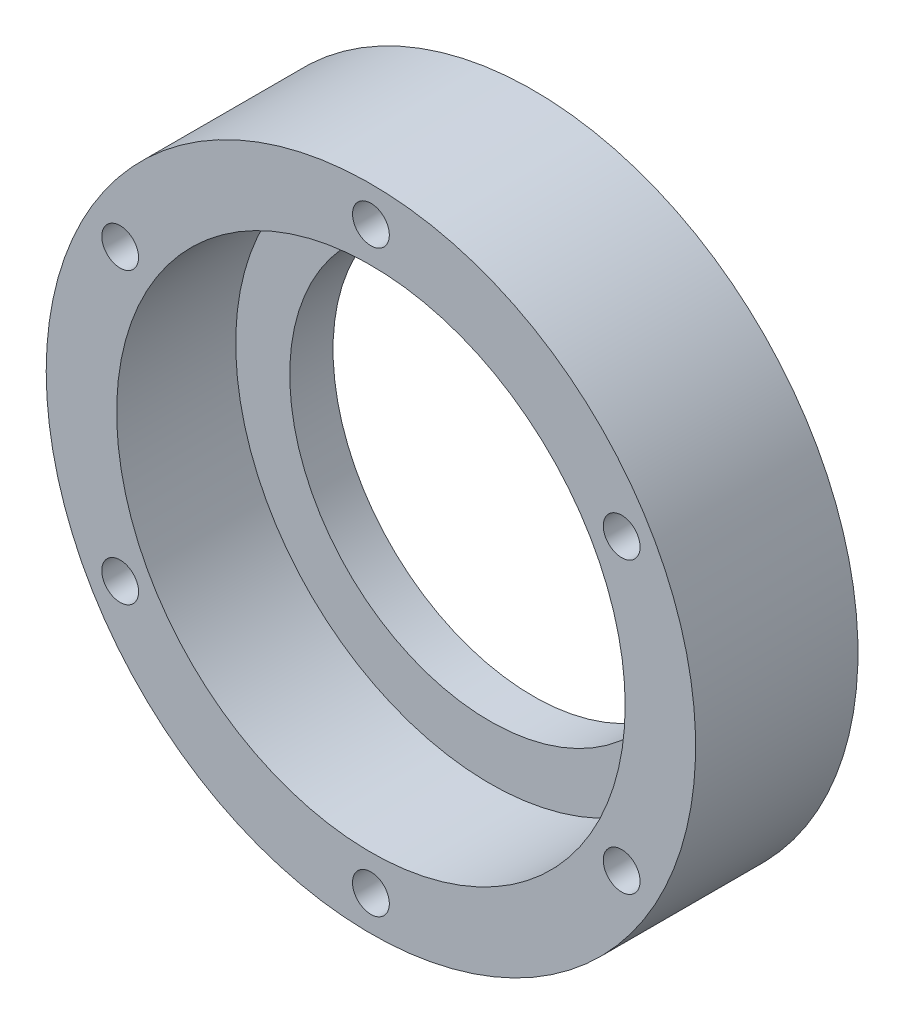
ISO-10303-21;
HEADER;
FILE_DESCRIPTION(('STEP AP214'),'2;1');
FILE_NAME('part.step','',(''),(''),'','','');
FILE_SCHEMA(('AUTOMOTIVE_DESIGN { 1 0 10303 214 1 1 1 1 }'));
ENDSEC;
DATA;
#1=APPLICATION_CONTEXT('core data for automotive mechanical design processes');
#2=APPLICATION_PROTOCOL_DEFINITION('international standard','automotive_design',2000,#1);
#3=PRODUCT_CONTEXT('',#1,'mechanical');
#4=PRODUCT('Part','Part','',(#3));
#5=PRODUCT_RELATED_PRODUCT_CATEGORY('part','',(#4));
#6=PRODUCT_DEFINITION_FORMATION('','',#4);
#7=PRODUCT_DEFINITION_CONTEXT('part definition',#1,'design');
#8=PRODUCT_DEFINITION('design','',#6,#7);
#9=PRODUCT_DEFINITION_SHAPE('','',#8);
#10=(LENGTH_UNIT() NAMED_UNIT(*) SI_UNIT(.MILLI.,.METRE.));
#11=(NAMED_UNIT(*) PLANE_ANGLE_UNIT() SI_UNIT($,.RADIAN.));
#12=(NAMED_UNIT(*) SI_UNIT($,.STERADIAN.) SOLID_ANGLE_UNIT());
#13=UNCERTAINTY_MEASURE_WITH_UNIT(LENGTH_MEASURE(1.E-05),#10,'distance_accuracy_value','');
#14=(GEOMETRIC_REPRESENTATION_CONTEXT(3) GLOBAL_UNCERTAINTY_ASSIGNED_CONTEXT((#13)) GLOBAL_UNIT_ASSIGNED_CONTEXT((#10,
#11,#12)) REPRESENTATION_CONTEXT('',''));
#15=CARTESIAN_POINT('',(0.,0.,0.));
#16=DIRECTION('',(0.,0.,1.));
#17=DIRECTION('',(1.,0.,0.));
#18=AXIS2_PLACEMENT_3D('',#15,#16,#17);
#19=CARTESIAN_POINT('',(0.,0.,15.));
#20=DIRECTION('',(0.,0.,-1.));
#21=DIRECTION('',(-1.,0.,0.));
#22=AXIS2_PLACEMENT_3D('',#19,#20,#21);
#23=CYLINDRICAL_SURFACE('',#22,30.);
#24=CARTESIAN_POINT('',(0.,0.,15.));
#25=DIRECTION('',(0.,0.,-1.));
#26=DIRECTION('',(-1.,0.,0.));
#27=AXIS2_PLACEMENT_3D('',#24,#25,#26);
#28=CIRCLE('',#27,30.);
#29=CARTESIAN_POINT('',(-30.,0.,15.));
#30=VERTEX_POINT('',#29);
#31=EDGE_CURVE('E78',#30,#30,#28,.T.);
#32=ORIENTED_EDGE('',*,*,#31,.T.);
#33=EDGE_LOOP('',(#32));
#34=FACE_BOUND('',#33,.T.);
#35=CARTESIAN_POINT('',(0.,0.,0.));
#36=DIRECTION('',(0.,0.,-1.));
#37=DIRECTION('',(-1.,0.,0.));
#38=AXIS2_PLACEMENT_3D('',#35,#36,#37);
#39=CIRCLE('',#38,30.);
#40=CARTESIAN_POINT('',(-30.,0.,0.));
#41=VERTEX_POINT('',#40);
#42=EDGE_CURVE('E81',#41,#41,#39,.T.);
#43=ORIENTED_EDGE('',*,*,#42,.F.);
#44=EDGE_LOOP('',(#43));
#45=FACE_BOUND('',#44,.T.);
#46=ADVANCED_FACE('F34',(#34,#45),#23,.T.);
#47=CARTESIAN_POINT('',(30.,0.,15.));
#48=DIRECTION('',(0.,0.,1.));
#49=DIRECTION('',(1.,0.,0.));
#50=AXIS2_PLACEMENT_3D('',#47,#48,#49);
#51=PLANE('',#50);
#52=CARTESIAN_POINT('',(0.,0.,15.));
#53=DIRECTION('',(0.,0.,1.));
#54=DIRECTION('',(1.,0.,0.));
#55=AXIS2_PLACEMENT_3D('',#52,#53,#54);
#56=CIRCLE('',#55,23.49119);
#57=CARTESIAN_POINT('',(23.49119,0.,15.));
#58=VERTEX_POINT('',#57);
#59=EDGE_CURVE('E111',#58,#58,#56,.T.);
#60=ORIENTED_EDGE('',*,*,#59,.F.);
#61=EDGE_LOOP('',(#60));
#62=FACE_BOUND('',#61,.T.);
#63=CARTESIAN_POINT('',(23.166179551236,-13.3749999999987,15.));
#64=DIRECTION('',(0.,0.,-1.));
#65=DIRECTION('',(-1.,0.,0.));
#66=AXIS2_PLACEMENT_3D('',#63,#64,#65);
#67=CIRCLE('',#66,1.69999999999999);
#68=CARTESIAN_POINT('',(21.466179551236,-13.3749999999987,15.));
#69=VERTEX_POINT('',#68);
#70=EDGE_CURVE('E99',#69,#69,#67,.T.);
#71=ORIENTED_EDGE('',*,*,#70,.T.);
#72=EDGE_LOOP('',(#71));
#73=FACE_BOUND('',#72,.T.);
#74=CARTESIAN_POINT('',(23.1661795512345,13.3750000000013,15.));
#75=DIRECTION('',(0.,0.,-1.));
#76=DIRECTION('',(-1.,0.,0.));
#77=AXIS2_PLACEMENT_3D('',#74,#75,#76);
#78=CIRCLE('',#77,1.69999999999999);
#79=CARTESIAN_POINT('',(21.4661795512345,13.3750000000013,15.));
#80=VERTEX_POINT('',#79);
#81=EDGE_CURVE('E96',#80,#80,#78,.T.);
#82=ORIENTED_EDGE('',*,*,#81,.T.);
#83=EDGE_LOOP('',(#82));
#84=FACE_BOUND('',#83,.T.);
#85=CARTESIAN_POINT('',(0.,26.75,15.));
#86=DIRECTION('',(0.,0.,-1.));
#87=DIRECTION('',(-1.,0.,0.));
#88=AXIS2_PLACEMENT_3D('',#85,#86,#87);
#89=CIRCLE('',#88,1.69999999999999);
#90=CARTESIAN_POINT('',(-1.69999999999999,26.75,15.));
#91=VERTEX_POINT('',#90);
#92=EDGE_CURVE('E93',#91,#91,#89,.T.);
#93=ORIENTED_EDGE('',*,*,#92,.T.);
#94=EDGE_LOOP('',(#93));
#95=FACE_BOUND('',#94,.T.);
#96=CARTESIAN_POINT('',(-23.1661795512315,-13.3750000000013,15.));
#97=DIRECTION('',(0.,0.,-1.));
#98=DIRECTION('',(-1.,0.,0.));
#99=AXIS2_PLACEMENT_3D('',#96,#97,#98);
#100=CIRCLE('',#99,1.69999999999999);
#101=CARTESIAN_POINT('',(-24.8661795512314,-13.3750000000013,15.));
#102=VERTEX_POINT('',#101);
#103=EDGE_CURVE('E90',#102,#102,#100,.T.);
#104=ORIENTED_EDGE('',*,*,#103,.T.);
#105=EDGE_LOOP('',(#104));
#106=FACE_BOUND('',#105,.T.);
#107=CARTESIAN_POINT('',(3.03457104867779E-12,-26.75,15.));
#108=DIRECTION('',(0.,0.,-1.));
#109=DIRECTION('',(-1.,0.,0.));
#110=AXIS2_PLACEMENT_3D('',#107,#108,#109);
#111=CIRCLE('',#110,1.69999999999999);
#112=CARTESIAN_POINT('',(-1.69999999999695,-26.75,15.));
#113=VERTEX_POINT('',#112);
#114=EDGE_CURVE('E87',#113,#113,#111,.T.);
#115=ORIENTED_EDGE('',*,*,#114,.T.);
#116=EDGE_LOOP('',(#115));
#117=FACE_BOUND('',#116,.T.);
#118=CARTESIAN_POINT('',(-23.166179551233,13.3749999999987,15.));
#119=DIRECTION('',(0.,0.,-1.));
#120=DIRECTION('',(-1.,0.,0.));
#121=AXIS2_PLACEMENT_3D('',#118,#119,#120);
#122=CIRCLE('',#121,1.69999999999999);
#123=CARTESIAN_POINT('',(-24.866179551233,13.3749999999987,15.));
#124=VERTEX_POINT('',#123);
#125=EDGE_CURVE('E84',#124,#124,#122,.T.);
#126=ORIENTED_EDGE('',*,*,#125,.T.);
#127=EDGE_LOOP('',(#126));
#128=FACE_BOUND('',#127,.T.);
#129=ORIENTED_EDGE('',*,*,#31,.F.);
#130=EDGE_LOOP('',(#129));
#131=FACE_BOUND('',#130,.T.);
#132=ADVANCED_FACE('F117',(#62,#73,#84,#95,#106,#117,#128,#131),#51,.T.);
#133=CARTESIAN_POINT('',(0.,0.,0.));
#134=DIRECTION('',(0.,0.,-1.));
#135=DIRECTION('',(-1.,0.,0.));
#136=AXIS2_PLACEMENT_3D('',#133,#134,#135);
#137=PLANE('',#136);
#138=CARTESIAN_POINT('',(-23.1661795512315,-13.3750000000013,0.));
#139=DIRECTION('',(0.,0.,-1.));
#140=DIRECTION('',(-1.,0.,0.));
#141=AXIS2_PLACEMENT_3D('',#138,#139,#140);
#142=CIRCLE('',#141,3.15000000006234);
#143=CARTESIAN_POINT('',(-26.3161795512938,-13.3750000000013,0.));
#144=VERTEX_POINT('',#143);
#145=EDGE_CURVE('E57',#144,#144,#142,.F.);
#146=ORIENTED_EDGE('',*,*,#145,.T.);
#147=EDGE_LOOP('',(#146));
#148=FACE_BOUND('',#147,.T.);
#149=CARTESIAN_POINT('',(-23.166179551233,13.3749999999987,0.));
#150=DIRECTION('',(0.,0.,-1.));
#151=DIRECTION('',(-1.,0.,0.));
#152=AXIS2_PLACEMENT_3D('',#149,#150,#151);
#153=CIRCLE('',#152,3.15000000006234);
#154=CARTESIAN_POINT('',(-26.3161795512953,13.3749999999987,0.));
#155=VERTEX_POINT('',#154);
#156=EDGE_CURVE('E60',#155,#155,#153,.F.);
#157=ORIENTED_EDGE('',*,*,#156,.T.);
#158=EDGE_LOOP('',(#157));
#159=FACE_BOUND('',#158,.T.);
#160=CARTESIAN_POINT('',(3.03457104867779E-12,-26.75,0.));
#161=DIRECTION('',(0.,0.,-1.));
#162=DIRECTION('',(-1.,0.,0.));
#163=AXIS2_PLACEMENT_3D('',#160,#161,#162);
#164=CIRCLE('',#163,3.15000000006234);
#165=CARTESIAN_POINT('',(-3.1500000000593,-26.75,0.));
#166=VERTEX_POINT('',#165);
#167=EDGE_CURVE('E63',#166,#166,#164,.F.);
#168=ORIENTED_EDGE('',*,*,#167,.T.);
#169=EDGE_LOOP('',(#168));
#170=FACE_BOUND('',#169,.T.);
#171=CARTESIAN_POINT('',(23.1661795512345,13.3750000000013,0.));
#172=DIRECTION('',(0.,0.,-1.));
#173=DIRECTION('',(-1.,0.,0.));
#174=AXIS2_PLACEMENT_3D('',#171,#172,#173);
#175=CIRCLE('',#174,3.15000000006235);
#176=CARTESIAN_POINT('',(20.0161795511721,13.3750000000013,0.));
#177=VERTEX_POINT('',#176);
#178=EDGE_CURVE('E66',#177,#177,#175,.F.);
#179=ORIENTED_EDGE('',*,*,#178,.T.);
#180=EDGE_LOOP('',(#179));
#181=FACE_BOUND('',#180,.T.);
#182=CARTESIAN_POINT('',(23.166179551236,-13.3749999999987,0.));
#183=DIRECTION('',(0.,0.,-1.));
#184=DIRECTION('',(-1.,0.,0.));
#185=AXIS2_PLACEMENT_3D('',#182,#183,#184);
#186=CIRCLE('',#185,3.15000000006235);
#187=CARTESIAN_POINT('',(20.0161795511737,-13.3749999999987,0.));
#188=VERTEX_POINT('',#187);
#189=EDGE_CURVE('E69',#188,#188,#186,.F.);
#190=ORIENTED_EDGE('',*,*,#189,.T.);
#191=EDGE_LOOP('',(#190));
#192=FACE_BOUND('',#191,.T.);
#193=CARTESIAN_POINT('',(0.,26.75,0.));
#194=DIRECTION('',(0.,0.,-1.));
#195=DIRECTION('',(-1.,0.,0.));
#196=AXIS2_PLACEMENT_3D('',#193,#194,#195);
#197=CIRCLE('',#196,3.15000000006235);
#198=CARTESIAN_POINT('',(-3.15000000006235,26.75,0.));
#199=VERTEX_POINT('',#198);
#200=EDGE_CURVE('E72',#199,#199,#197,.F.);
#201=ORIENTED_EDGE('',*,*,#200,.T.);
#202=EDGE_LOOP('',(#201));
#203=FACE_BOUND('',#202,.T.);
#204=CARTESIAN_POINT('',(0.,0.,0.));
#205=DIRECTION('',(0.,0.,1.));
#206=DIRECTION('',(1.,0.,0.));
#207=AXIS2_PLACEMENT_3D('',#204,#205,#206);
#208=CIRCLE('',#207,18.5);
#209=CARTESIAN_POINT('',(18.5,0.,0.));
#210=VERTEX_POINT('',#209);
#211=EDGE_CURVE('E102',#210,#210,#208,.T.);
#212=ORIENTED_EDGE('',*,*,#211,.T.);
#213=EDGE_LOOP('',(#212));
#214=FACE_BOUND('',#213,.T.);
#215=ORIENTED_EDGE('',*,*,#42,.T.);
#216=EDGE_LOOP('',(#215));
#217=FACE_BOUND('',#216,.T.);
#218=ADVANCED_FACE('F120',(#148,#159,#170,#181,#192,#203,#214,#217),#137,.T.);
#219=CARTESIAN_POINT('',(-23.166179551233,13.3749999999987,0.));
#220=DIRECTION('',(0.,0.,-1.));
#221=DIRECTION('',(-1.,0.,0.));
#222=AXIS2_PLACEMENT_3D('',#219,#220,#221);
#223=CYLINDRICAL_SURFACE('',#222,1.69999999999999);
#224=CARTESIAN_POINT('',(-23.166179551233,13.3749999999987,1.45000000006235));
#225=DIRECTION('',(0.,0.,-1.));
#226=DIRECTION('',(-1.,0.,0.));
#227=AXIS2_PLACEMENT_3D('',#224,#225,#226);
#228=CIRCLE('',#227,1.69999999999999);
#229=CARTESIAN_POINT('',(-24.866179551233,13.3749999999987,1.45000000006235));
#230=VERTEX_POINT('',#229);
#231=EDGE_CURVE('E54',#230,#230,#228,.T.);
#232=ORIENTED_EDGE('',*,*,#231,.T.);
#233=EDGE_LOOP('',(#232));
#234=FACE_BOUND('',#233,.T.);
#235=ORIENTED_EDGE('',*,*,#125,.F.);
#236=EDGE_LOOP('',(#235));
#237=FACE_BOUND('',#236,.T.);
#238=ADVANCED_FACE('F142',(#234,#237),#223,.F.);
#239=CARTESIAN_POINT('',(3.03457104867779E-12,-26.75,0.));
#240=DIRECTION('',(0.,0.,-1.));
#241=DIRECTION('',(-1.,0.,0.));
#242=AXIS2_PLACEMENT_3D('',#239,#240,#241);
#243=CYLINDRICAL_SURFACE('',#242,1.69999999999999);
#244=CARTESIAN_POINT('',(3.03457104867779E-12,-26.75,1.45000000006234));
#245=DIRECTION('',(0.,0.,-1.));
#246=DIRECTION('',(-1.,0.,0.));
#247=AXIS2_PLACEMENT_3D('',#244,#245,#246);
#248=CIRCLE('',#247,1.69999999999999);
#249=CARTESIAN_POINT('',(-1.69999999999695,-26.75,1.45000000006234));
#250=VERTEX_POINT('',#249);
#251=EDGE_CURVE('E49',#250,#250,#248,.T.);
#252=ORIENTED_EDGE('',*,*,#251,.T.);
#253=EDGE_LOOP('',(#252));
#254=FACE_BOUND('',#253,.T.);
#255=ORIENTED_EDGE('',*,*,#114,.F.);
#256=EDGE_LOOP('',(#255));
#257=FACE_BOUND('',#256,.T.);
#258=ADVANCED_FACE('F148',(#254,#257),#243,.F.);
#259=CARTESIAN_POINT('',(-23.1661795512315,-13.3750000000013,0.));
#260=DIRECTION('',(0.,0.,-1.));
#261=DIRECTION('',(-1.,0.,0.));
#262=AXIS2_PLACEMENT_3D('',#259,#260,#261);
#263=CYLINDRICAL_SURFACE('',#262,1.69999999999999);
#264=CARTESIAN_POINT('',(-23.1661795512315,-13.3750000000013,1.45000000006235));
#265=DIRECTION('',(0.,0.,-1.));
#266=DIRECTION('',(-1.,0.,0.));
#267=AXIS2_PLACEMENT_3D('',#264,#265,#266);
#268=CIRCLE('',#267,1.69999999999999);
#269=CARTESIAN_POINT('',(-24.8661795512314,-13.3750000000013,1.45000000006235));
#270=VERTEX_POINT('',#269);
#271=EDGE_CURVE('E75',#270,#270,#268,.T.);
#272=ORIENTED_EDGE('',*,*,#271,.T.);
#273=EDGE_LOOP('',(#272));
#274=FACE_BOUND('',#273,.T.);
#275=ORIENTED_EDGE('',*,*,#103,.F.);
#276=EDGE_LOOP('',(#275));
#277=FACE_BOUND('',#276,.T.);
#278=ADVANCED_FACE('F211',(#274,#277),#263,.F.);
#279=CARTESIAN_POINT('',(0.,26.75,0.));
#280=DIRECTION('',(0.,0.,-1.));
#281=DIRECTION('',(-1.,0.,0.));
#282=AXIS2_PLACEMENT_3D('',#279,#280,#281);
#283=CYLINDRICAL_SURFACE('',#282,1.69999999999999);
#284=CARTESIAN_POINT('',(0.,26.75,1.45000000006235));
#285=DIRECTION('',(0.,0.,-1.));
#286=DIRECTION('',(-1.,0.,0.));
#287=AXIS2_PLACEMENT_3D('',#284,#285,#286);
#288=CIRCLE('',#287,1.69999999999999);
#289=CARTESIAN_POINT('',(-1.69999999999999,26.75,1.45000000006235));
#290=VERTEX_POINT('',#289);
#291=EDGE_CURVE('E10',#290,#290,#288,.T.);
#292=ORIENTED_EDGE('',*,*,#291,.T.);
#293=EDGE_LOOP('',(#292));
#294=FACE_BOUND('',#293,.T.);
#295=ORIENTED_EDGE('',*,*,#92,.F.);
#296=EDGE_LOOP('',(#295));
#297=FACE_BOUND('',#296,.T.);
#298=ADVANCED_FACE('F207',(#294,#297),#283,.F.);
#299=CARTESIAN_POINT('',(23.1661795512345,13.3750000000013,0.));
#300=DIRECTION('',(0.,0.,-1.));
#301=DIRECTION('',(-1.,0.,0.));
#302=AXIS2_PLACEMENT_3D('',#299,#300,#301);
#303=CYLINDRICAL_SURFACE('',#302,1.69999999999999);
#304=CARTESIAN_POINT('',(23.1661795512345,13.3750000000013,1.45000000006235));
#305=DIRECTION('',(0.,0.,-1.));
#306=DIRECTION('',(-1.,0.,0.));
#307=AXIS2_PLACEMENT_3D('',#304,#305,#306);
#308=CIRCLE('',#307,1.69999999999999);
#309=CARTESIAN_POINT('',(21.4661795512345,13.3750000000013,1.45000000006235));
#310=VERTEX_POINT('',#309);
#311=EDGE_CURVE('E45',#310,#310,#308,.T.);
#312=ORIENTED_EDGE('',*,*,#311,.T.);
#313=EDGE_LOOP('',(#312));
#314=FACE_BOUND('',#313,.T.);
#315=ORIENTED_EDGE('',*,*,#81,.F.);
#316=EDGE_LOOP('',(#315));
#317=FACE_BOUND('',#316,.T.);
#318=ADVANCED_FACE('F204',(#314,#317),#303,.F.);
#319=CARTESIAN_POINT('',(23.166179551236,-13.3749999999987,0.));
#320=DIRECTION('',(0.,0.,-1.));
#321=DIRECTION('',(-1.,0.,0.));
#322=AXIS2_PLACEMENT_3D('',#319,#320,#321);
#323=CYLINDRICAL_SURFACE('',#322,1.69999999999999);
#324=CARTESIAN_POINT('',(23.166179551236,-13.3749999999987,1.45000000006235));
#325=DIRECTION('',(0.,0.,-1.));
#326=DIRECTION('',(-1.,0.,0.));
#327=AXIS2_PLACEMENT_3D('',#324,#325,#326);
#328=CIRCLE('',#327,1.69999999999999);
#329=CARTESIAN_POINT('',(21.466179551236,-13.3749999999987,1.45000000006235));
#330=VERTEX_POINT('',#329);
#331=EDGE_CURVE('E41',#330,#330,#328,.T.);
#332=ORIENTED_EDGE('',*,*,#331,.T.);
#333=EDGE_LOOP('',(#332));
#334=FACE_BOUND('',#333,.T.);
#335=ORIENTED_EDGE('',*,*,#70,.F.);
#336=EDGE_LOOP('',(#335));
#337=FACE_BOUND('',#336,.T.);
#338=ADVANCED_FACE('F188',(#334,#337),#323,.F.);
#339=CARTESIAN_POINT('',(0.,0.,15.));
#340=DIRECTION('',(0.,0.,1.));
#341=DIRECTION('',(1.,0.,0.));
#342=AXIS2_PLACEMENT_3D('',#339,#340,#341);
#343=CYLINDRICAL_SURFACE('',#342,18.5);
#344=ORIENTED_EDGE('',*,*,#211,.F.);
#345=EDGE_LOOP('',(#344));
#346=FACE_BOUND('',#345,.T.);
#347=CARTESIAN_POINT('',(0.,0.,4.));
#348=DIRECTION('',(0.,0.,1.));
#349=DIRECTION('',(1.,0.,0.));
#350=AXIS2_PLACEMENT_3D('',#347,#348,#349);
#351=CIRCLE('',#350,18.5);
#352=CARTESIAN_POINT('',(18.5,0.,4.));
#353=VERTEX_POINT('',#352);
#354=EDGE_CURVE('E105',#353,#353,#351,.T.);
#355=ORIENTED_EDGE('',*,*,#354,.T.);
#356=EDGE_LOOP('',(#355));
#357=FACE_BOUND('',#356,.T.);
#358=ADVANCED_FACE('F184',(#346,#357),#343,.F.);
#359=CARTESIAN_POINT('',(18.5,0.,4.));
#360=DIRECTION('',(0.,0.,-1.));
#361=DIRECTION('',(-1.,0.,0.));
#362=AXIS2_PLACEMENT_3D('',#359,#360,#361);
#363=PLANE('',#362);
#364=ORIENTED_EDGE('',*,*,#354,.F.);
#365=EDGE_LOOP('',(#364));
#366=FACE_BOUND('',#365,.T.);
#367=CARTESIAN_POINT('',(0.,0.,4.));
#368=DIRECTION('',(0.,0.,1.));
#369=DIRECTION('',(1.,0.,0.));
#370=AXIS2_PLACEMENT_3D('',#367,#368,#369);
#371=CIRCLE('',#370,23.49119);
#372=CARTESIAN_POINT('',(23.49119,0.,4.));
#373=VERTEX_POINT('',#372);
#374=EDGE_CURVE('E108',#373,#373,#371,.T.);
#375=ORIENTED_EDGE('',*,*,#374,.T.);
#376=EDGE_LOOP('',(#375));
#377=FACE_BOUND('',#376,.T.);
#378=ADVANCED_FACE('F187',(#366,#377),#363,.F.);
#379=CARTESIAN_POINT('',(0.,0.,15.));
#380=DIRECTION('',(0.,0.,1.));
#381=DIRECTION('',(1.,0.,0.));
#382=AXIS2_PLACEMENT_3D('',#379,#380,#381);
#383=CYLINDRICAL_SURFACE('',#382,23.49119);
#384=ORIENTED_EDGE('',*,*,#374,.F.);
#385=EDGE_LOOP('',(#384));
#386=FACE_BOUND('',#385,.T.);
#387=ORIENTED_EDGE('',*,*,#59,.T.);
#388=EDGE_LOOP('',(#387));
#389=FACE_BOUND('',#388,.T.);
#390=ADVANCED_FACE('F115',(#386,#389),#383,.F.);
#391=CARTESIAN_POINT('',(-23.1661795512315,-13.3750000000013,1.45000000006235));
#392=DIRECTION('',(0.,0.,-1.));
#393=DIRECTION('',(-1.,0.,0.));
#394=AXIS2_PLACEMENT_3D('',#391,#392,#393);
#395=CONICAL_SURFACE('',#394,1.69999999999999,0.78539816339745);
#396=CARTESIAN_POINT('',(-26.3161795512938,-13.3750000000013,0.));
#397=CARTESIAN_POINT('',(-26.3010753846265,-13.3750000000013,0.0151041666673163));
#398=CARTESIAN_POINT('',(-26.2859712179592,-13.3750000000013,0.0302083333346324));
#399=CARTESIAN_POINT('',(-26.2557628846245,-13.3750000000013,0.0604166666692647));
#400=CARTESIAN_POINT('',(-26.2406587179572,-13.3750000000013,0.0755208333365809));
#401=CARTESIAN_POINT('',(-26.2104503846226,-13.3750000000013,0.105729166671213));
#402=CARTESIAN_POINT('',(-26.1953462179553,-13.3750000000013,0.120833333338529));
#403=CARTESIAN_POINT('',(-26.1651378846206,-13.3750000000013,0.151041666673162));
#404=CARTESIAN_POINT('',(-26.1500337179533,-13.3750000000013,0.166145833340478));
#405=CARTESIAN_POINT('',(-26.1198253846187,-13.3750000000013,0.19635416667511));
#406=CARTESIAN_POINT('',(-26.1047212179514,-13.3750000000013,0.211458333342426));
#407=CARTESIAN_POINT('',(-26.0745128846167,-13.3750000000013,0.241666666677058));
#408=CARTESIAN_POINT('',(-26.0594087179494,-13.3750000000013,0.256770833344374));
#409=CARTESIAN_POINT('',(-26.0292003846148,-13.3750000000013,0.286979166679007));
#410=CARTESIAN_POINT('',(-26.0140962179475,-13.3750000000013,0.302083333346323));
#411=CARTESIAN_POINT('',(-25.9838878846128,-13.3750000000013,0.332291666680955));
#412=CARTESIAN_POINT('',(-25.9687837179455,-13.3750000000013,0.347395833348271));
#413=CARTESIAN_POINT('',(-25.9385753846109,-13.3750000000013,0.377604166682903));
#414=CARTESIAN_POINT('',(-25.9234712179436,-13.3750000000013,0.39270833335022));
#415=CARTESIAN_POINT('',(-25.8932628846089,-13.3750000000013,0.422916666684852));
#416=CARTESIAN_POINT('',(-25.8781587179416,-13.3750000000013,0.438020833352168));
#417=CARTESIAN_POINT('',(-25.847950384607,-13.3750000000013,0.4682291666868));
#418=CARTESIAN_POINT('',(-25.8328462179397,-13.3750000000013,0.483333333354116));
#419=CARTESIAN_POINT('',(-25.802637884605,-13.3750000000013,0.513541666688749));
#420=CARTESIAN_POINT('',(-25.7875337179377,-13.3750000000013,0.528645833356065));
#421=CARTESIAN_POINT('',(-25.7573253846031,-13.3750000000013,0.558854166690697));
#422=CARTESIAN_POINT('',(-25.7422212179358,-13.3750000000013,0.573958333358013));
#423=CARTESIAN_POINT('',(-25.7120128846011,-13.3750000000013,0.604166666692645));
#424=CARTESIAN_POINT('',(-25.6969087179338,-13.3750000000013,0.619270833359961));
#425=CARTESIAN_POINT('',(-25.6667003845992,-13.3750000000013,0.649479166694594));
#426=CARTESIAN_POINT('',(-25.6515962179319,-13.3750000000013,0.66458333336191));
#427=CARTESIAN_POINT('',(-25.6213878845973,-13.3750000000013,0.694791666696542));
#428=CARTESIAN_POINT('',(-25.6062837179299,-13.3750000000013,0.709895833363858));
#429=CARTESIAN_POINT('',(-25.5760753845953,-13.3750000000013,0.74010416669849));
#430=CARTESIAN_POINT('',(-25.560971217928,-13.3750000000013,0.755208333365807));
#431=CARTESIAN_POINT('',(-25.5307628845934,-13.3750000000013,0.785416666700439));
#432=CARTESIAN_POINT('',(-25.515658717926,-13.3750000000013,0.800520833367755));
#433=CARTESIAN_POINT('',(-25.4854503845914,-13.3750000000013,0.830729166702388));
#434=CARTESIAN_POINT('',(-25.4703462179241,-13.3750000000013,0.845833333369703));
#435=CARTESIAN_POINT('',(-25.4401378845895,-13.3750000000013,0.876041666704335));
#436=CARTESIAN_POINT('',(-25.4250337179221,-13.3750000000013,0.891145833371652));
#437=CARTESIAN_POINT('',(-25.3948253845875,-13.3750000000013,0.921354166706284));
#438=CARTESIAN_POINT('',(-25.3797212179202,-13.3750000000013,0.9364583333736));
#439=CARTESIAN_POINT('',(-25.3495128845856,-13.3750000000013,0.966666666708232));
#440=CARTESIAN_POINT('',(-25.3344087179182,-13.3750000000013,0.981770833375548));
#441=CARTESIAN_POINT('',(-25.3042003845836,-13.3750000000013,1.01197916671018));
#442=CARTESIAN_POINT('',(-25.2890962179163,-13.3750000000013,1.0270833333775));
#443=CARTESIAN_POINT('',(-25.2588878845817,-13.3750000000013,1.05729166671213));
#444=CARTESIAN_POINT('',(-25.2437837179143,-13.3750000000013,1.07239583337945));
#445=CARTESIAN_POINT('',(-25.2135753845797,-13.3750000000013,1.10260416671408));
#446=CARTESIAN_POINT('',(-25.1984712179124,-13.3750000000013,1.11770833338139));
#447=CARTESIAN_POINT('',(-25.1682628845778,-13.3750000000013,1.14791666671603));
#448=CARTESIAN_POINT('',(-25.1531587179105,-13.3750000000013,1.16302083338334));
#449=CARTESIAN_POINT('',(-25.1229503845758,-13.3750000000013,1.19322916671797));
#450=CARTESIAN_POINT('',(-25.1078462179085,-13.3750000000013,1.20833333338529));
#451=CARTESIAN_POINT('',(-25.0776378845739,-13.3750000000013,1.23854166671992));
#452=CARTESIAN_POINT('',(-25.0625337179066,-13.3750000000013,1.25364583338724));
#453=CARTESIAN_POINT('',(-25.0323253845719,-13.3750000000013,1.28385416672187));
#454=CARTESIAN_POINT('',(-25.0172212179046,-13.3750000000013,1.29895833338919));
#455=CARTESIAN_POINT('',(-24.98701288457,-13.3750000000013,1.32916666672382));
#456=CARTESIAN_POINT('',(-24.9719087179027,-13.3750000000013,1.34427083339114));
#457=CARTESIAN_POINT('',(-24.941700384568,-13.3750000000013,1.37447916672577));
#458=CARTESIAN_POINT('',(-24.9265962179007,-13.3750000000013,1.38958333339308));
#459=CARTESIAN_POINT('',(-24.8963878845661,-13.3750000000013,1.41979166672772));
#460=CARTESIAN_POINT('',(-24.8812837178988,-13.3750000000013,1.43489583339503));
#461=CARTESIAN_POINT('',(-24.8661795512314,-13.3750000000013,1.45000000006235));
#462=B_SPLINE_CURVE_WITH_KNOTS('',3,(#396,#397,#398,#399,#400,#401,#402,#403,#404,#405,#406,
#407,#408,#409,#410,#411,#412,#413,#414,#415,#416,#417,#418,#419,#420,#421,#422,#423,#424,#425,
#426,#427,#428,#429,#430,#431,#432,#433,#434,#435,#436,#437,#438,#439,#440,#441,#442,#443,#444,
#445,#446,#447,#448,#449,#450,#451,#452,#453,#454,#455,#456,#457,#458,#459,#460,#461),
.UNSPECIFIED.,.F.,.F.,(4,2,2,2,2,2,2,2,2,2,2,2,2,2,2,2,2,2,2,2,2,2,2,2,2,2,2,2,2,2,2,2,4),(0.,
0.0640815520477862,0.128163104095573,0.192244656143359,0.256326208191145,0.320407760238931,
0.384489312286717,0.448570864334504,0.512652416382292,0.576733968430079,0.640815520477865,
0.704897072525651,0.768978624573437,0.833060176621224,0.89714172866901,0.961223280716796,
1.02530483276458,1.08938638481237,1.15346793686016,1.21754948890794,1.28163104095573,
1.34571259300352,1.4097941450513,1.47387569709909,1.53795724914687,1.60203880119466,
1.66612035324245,1.73020190529023,1.79428345733802,1.85836500938581,1.92244656143359,
1.98652811348138,2.05060966552917),.UNSPECIFIED.);
#463=EDGE_CURVE('BSEAM154',#144,#270,#462,.T.);
#464=ORIENTED_EDGE('',*,*,#145,.F.);
#465=ORIENTED_EDGE('',*,*,#271,.F.);
#466=ORIENTED_EDGE('',*,*,#463,.T.);
#467=ORIENTED_EDGE('',*,*,#463,.F.);
#468=EDGE_LOOP('',(#464,#466,#465,#467));
#469=FACE_BOUND('',#468,.T.);
#470=ADVANCED_FACE('F154',(#469),#395,.F.);
#471=CARTESIAN_POINT('',(-23.166179551233,13.3749999999987,1.45000000006235));
#472=DIRECTION('',(0.,0.,-1.));
#473=DIRECTION('',(-1.,0.,0.));
#474=AXIS2_PLACEMENT_3D('',#471,#472,#473);
#475=CONICAL_SURFACE('',#474,1.69999999999999,0.78539816339745);
#476=CARTESIAN_POINT('',(-26.3161795512953,13.3749999999987,0.));
#477=CARTESIAN_POINT('',(-26.301075384628,13.3749999999987,0.0151041666673163));
#478=CARTESIAN_POINT('',(-26.2859712179607,13.3749999999987,0.0302083333346324));
#479=CARTESIAN_POINT('',(-26.2557628846261,13.3749999999987,0.0604166666692647));
#480=CARTESIAN_POINT('',(-26.2406587179588,13.3749999999987,0.0755208333365809));
#481=CARTESIAN_POINT('',(-26.2104503846241,13.3749999999987,0.105729166671213));
#482=CARTESIAN_POINT('',(-26.1953462179568,13.3749999999987,0.120833333338529));
#483=CARTESIAN_POINT('',(-26.1651378846222,13.3749999999987,0.151041666673162));
#484=CARTESIAN_POINT('',(-26.1500337179549,13.3749999999987,0.166145833340478));
#485=CARTESIAN_POINT('',(-26.1198253846202,13.3749999999987,0.19635416667511));
#486=CARTESIAN_POINT('',(-26.1047212179529,13.3749999999987,0.211458333342426));
#487=CARTESIAN_POINT('',(-26.0745128846183,13.3749999999987,0.241666666677058));
#488=CARTESIAN_POINT('',(-26.059408717951,13.3749999999987,0.256770833344374));
#489=CARTESIAN_POINT('',(-26.0292003846163,13.3749999999987,0.286979166679007));
#490=CARTESIAN_POINT('',(-26.014096217949,13.3749999999987,0.302083333346323));
#491=CARTESIAN_POINT('',(-25.9838878846144,13.3749999999987,0.332291666680955));
#492=CARTESIAN_POINT('',(-25.9687837179471,13.3749999999987,0.347395833348271));
#493=CARTESIAN_POINT('',(-25.9385753846124,13.3749999999987,0.377604166682903));
#494=CARTESIAN_POINT('',(-25.9234712179451,13.3749999999987,0.39270833335022));
#495=CARTESIAN_POINT('',(-25.8932628846105,13.3749999999987,0.422916666684852));
#496=CARTESIAN_POINT('',(-25.8781587179432,13.3749999999987,0.438020833352168));
#497=CARTESIAN_POINT('',(-25.8479503846085,13.3749999999987,0.4682291666868));
#498=CARTESIAN_POINT('',(-25.8328462179412,13.3749999999987,0.483333333354116));
#499=CARTESIAN_POINT('',(-25.8026378846066,13.3749999999987,0.513541666688749));
#500=CARTESIAN_POINT('',(-25.7875337179393,13.3749999999987,0.528645833356065));
#501=CARTESIAN_POINT('',(-25.7573253846046,13.3749999999987,0.558854166690697));
#502=CARTESIAN_POINT('',(-25.7422212179373,13.3749999999987,0.573958333358013));
#503=CARTESIAN_POINT('',(-25.7120128846027,13.3749999999987,0.604166666692645));
#504=CARTESIAN_POINT('',(-25.6969087179354,13.3749999999987,0.619270833359961));
#505=CARTESIAN_POINT('',(-25.6667003846007,13.3749999999987,0.649479166694594));
#506=CARTESIAN_POINT('',(-25.6515962179334,13.3749999999987,0.66458333336191));
#507=CARTESIAN_POINT('',(-25.6213878845988,13.3749999999987,0.694791666696542));
#508=CARTESIAN_POINT('',(-25.6062837179315,13.3749999999987,0.709895833363858));
#509=CARTESIAN_POINT('',(-25.5760753845968,13.3749999999987,0.74010416669849));
#510=CARTESIAN_POINT('',(-25.5609712179295,13.3749999999987,0.755208333365807));
#511=CARTESIAN_POINT('',(-25.5307628845949,13.3749999999987,0.785416666700439));
#512=CARTESIAN_POINT('',(-25.5156587179276,13.3749999999987,0.800520833367755));
#513=CARTESIAN_POINT('',(-25.4854503845929,13.3749999999987,0.830729166702388));
#514=CARTESIAN_POINT('',(-25.4703462179256,13.3749999999987,0.845833333369703));
#515=CARTESIAN_POINT('',(-25.440137884591,13.3749999999987,0.876041666704335));
#516=CARTESIAN_POINT('',(-25.4250337179237,13.3749999999987,0.891145833371652));
#517=CARTESIAN_POINT('',(-25.394825384589,13.3749999999987,0.921354166706284));
#518=CARTESIAN_POINT('',(-25.3797212179217,13.3749999999987,0.9364583333736));
#519=CARTESIAN_POINT('',(-25.3495128845871,13.3749999999987,0.966666666708232));
#520=CARTESIAN_POINT('',(-25.3344087179198,13.3749999999987,0.981770833375548));
#521=CARTESIAN_POINT('',(-25.3042003845851,13.3749999999987,1.01197916671018));
#522=CARTESIAN_POINT('',(-25.2890962179178,13.3749999999987,1.0270833333775));
#523=CARTESIAN_POINT('',(-25.2588878845832,13.3749999999987,1.05729166671213));
#524=CARTESIAN_POINT('',(-25.2437837179159,13.3749999999987,1.07239583337945));
#525=CARTESIAN_POINT('',(-25.2135753845812,13.3749999999987,1.10260416671408));
#526=CARTESIAN_POINT('',(-25.1984712179139,13.3749999999987,1.11770833338139));
#527=CARTESIAN_POINT('',(-25.1682628845793,13.3749999999987,1.14791666671603));
#528=CARTESIAN_POINT('',(-25.153158717912,13.3749999999987,1.16302083338334));
#529=CARTESIAN_POINT('',(-25.1229503845774,13.3749999999987,1.19322916671797));
#530=CARTESIAN_POINT('',(-25.10784621791,13.3749999999987,1.20833333338529));
#531=CARTESIAN_POINT('',(-25.0776378845754,13.3749999999987,1.23854166671992));
#532=CARTESIAN_POINT('',(-25.0625337179081,13.3749999999987,1.25364583338724));
#533=CARTESIAN_POINT('',(-25.0323253845735,13.3749999999987,1.28385416672187));
#534=CARTESIAN_POINT('',(-25.0172212179061,13.3749999999987,1.29895833338919));
#535=CARTESIAN_POINT('',(-24.9870128845715,13.3749999999987,1.32916666672382));
#536=CARTESIAN_POINT('',(-24.9719087179042,13.3749999999987,1.34427083339114));
#537=CARTESIAN_POINT('',(-24.9417003845696,13.3749999999987,1.37447916672577));
#538=CARTESIAN_POINT('',(-24.9265962179022,13.3749999999987,1.38958333339308));
#539=CARTESIAN_POINT('',(-24.8963878845676,13.3749999999987,1.41979166672772));
#540=CARTESIAN_POINT('',(-24.8812837179003,13.3749999999987,1.43489583339503));
#541=CARTESIAN_POINT('',(-24.866179551233,13.3749999999987,1.45000000006235));
#542=B_SPLINE_CURVE_WITH_KNOTS('',3,(#476,#477,#478,#479,#480,#481,#482,#483,#484,#485,#486,
#487,#488,#489,#490,#491,#492,#493,#494,#495,#496,#497,#498,#499,#500,#501,#502,#503,#504,#505,
#506,#507,#508,#509,#510,#511,#512,#513,#514,#515,#516,#517,#518,#519,#520,#521,#522,#523,#524,
#525,#526,#527,#528,#529,#530,#531,#532,#533,#534,#535,#536,#537,#538,#539,#540,#541),
.UNSPECIFIED.,.F.,.F.,(4,2,2,2,2,2,2,2,2,2,2,2,2,2,2,2,2,2,2,2,2,2,2,2,2,2,2,2,2,2,2,2,4),(0.,
0.0640815520477862,0.128163104095573,0.192244656143359,0.256326208191145,0.320407760238931,
0.384489312286717,0.448570864334504,0.512652416382292,0.576733968430079,0.640815520477865,
0.704897072525651,0.768978624573437,0.833060176621224,0.89714172866901,0.961223280716796,
1.02530483276458,1.08938638481237,1.15346793686016,1.21754948890794,1.28163104095573,
1.34571259300352,1.4097941450513,1.47387569709909,1.53795724914687,1.60203880119466,
1.66612035324245,1.73020190529023,1.79428345733802,1.85836500938581,1.92244656143359,
1.98652811348138,2.05060966552917),.UNSPECIFIED.);
#543=EDGE_CURVE('BSEAM157',#155,#230,#542,.T.);
#544=ORIENTED_EDGE('',*,*,#156,.F.);
#545=ORIENTED_EDGE('',*,*,#231,.F.);
#546=ORIENTED_EDGE('',*,*,#543,.T.);
#547=ORIENTED_EDGE('',*,*,#543,.F.);
#548=EDGE_LOOP('',(#544,#546,#545,#547));
#549=FACE_BOUND('',#548,.T.);
#550=ADVANCED_FACE('F157',(#549),#475,.F.);
#551=CARTESIAN_POINT('',(3.03457104867779E-12,-26.75,1.45000000006234));
#552=DIRECTION('',(0.,0.,-1.));
#553=DIRECTION('',(-1.,0.,0.));
#554=AXIS2_PLACEMENT_3D('',#551,#552,#553);
#555=CONICAL_SURFACE('',#554,1.69999999999999,0.785398163397454);
#556=ORIENTED_EDGE('',*,*,#167,.F.);
#557=EDGE_LOOP('',(#556));
#558=FACE_BOUND('',#557,.T.);
#559=ORIENTED_EDGE('',*,*,#251,.F.);
#560=EDGE_LOOP('',(#559));
#561=FACE_BOUND('',#560,.T.);
#562=ADVANCED_FACE('F161',(#558,#561),#555,.F.);
#563=CARTESIAN_POINT('',(23.1661795512345,13.3750000000013,1.45000000006235));
#564=DIRECTION('',(0.,0.,-1.));
#565=DIRECTION('',(-1.,0.,0.));
#566=AXIS2_PLACEMENT_3D('',#563,#564,#565);
#567=CONICAL_SURFACE('',#566,1.69999999999999,0.785398163397451);
#568=ORIENTED_EDGE('',*,*,#178,.F.);
#569=EDGE_LOOP('',(#568));
#570=FACE_BOUND('',#569,.T.);
#571=ORIENTED_EDGE('',*,*,#311,.F.);
#572=EDGE_LOOP('',(#571));
#573=FACE_BOUND('',#572,.T.);
#574=ADVANCED_FACE('F165',(#570,#573),#567,.F.);
#575=CARTESIAN_POINT('',(23.166179551236,-13.3749999999987,1.45000000006235));
#576=DIRECTION('',(0.,0.,-1.));
#577=DIRECTION('',(-1.,0.,0.));
#578=AXIS2_PLACEMENT_3D('',#575,#576,#577);
#579=CONICAL_SURFACE('',#578,1.69999999999999,0.785398163397451);
#580=ORIENTED_EDGE('',*,*,#189,.F.);
#581=EDGE_LOOP('',(#580));
#582=FACE_BOUND('',#581,.T.);
#583=ORIENTED_EDGE('',*,*,#331,.F.);
#584=EDGE_LOOP('',(#583));
#585=FACE_BOUND('',#584,.T.);
#586=ADVANCED_FACE('F168',(#582,#585),#579,.F.);
#587=CARTESIAN_POINT('',(0.,26.75,1.45000000006235));
#588=DIRECTION('',(0.,0.,-1.));
#589=DIRECTION('',(-1.,0.,0.));
#590=AXIS2_PLACEMENT_3D('',#587,#588,#589);
#591=CONICAL_SURFACE('',#590,1.69999999999999,0.785398163397454);
#592=ORIENTED_EDGE('',*,*,#200,.F.);
#593=EDGE_LOOP('',(#592));
#594=FACE_BOUND('',#593,.T.);
#595=ORIENTED_EDGE('',*,*,#291,.F.);
#596=EDGE_LOOP('',(#595));
#597=FACE_BOUND('',#596,.T.);
#598=ADVANCED_FACE('F36',(#594,#597),#591,.F.);
#599=CLOSED_SHELL('',(#46,#132,#218,#238,#258,#278,#298,#318,#338,#358,#378,#390,#470,#550,#562,
#574,#586,#598));
#600=MANIFOLD_SOLID_BREP('B2',#599);
#601=ADVANCED_BREP_SHAPE_REPRESENTATION('',(#18,#600),#14);
#602=SHAPE_DEFINITION_REPRESENTATION(#9,#601);
ENDSEC;
END-ISO-10303-21;
